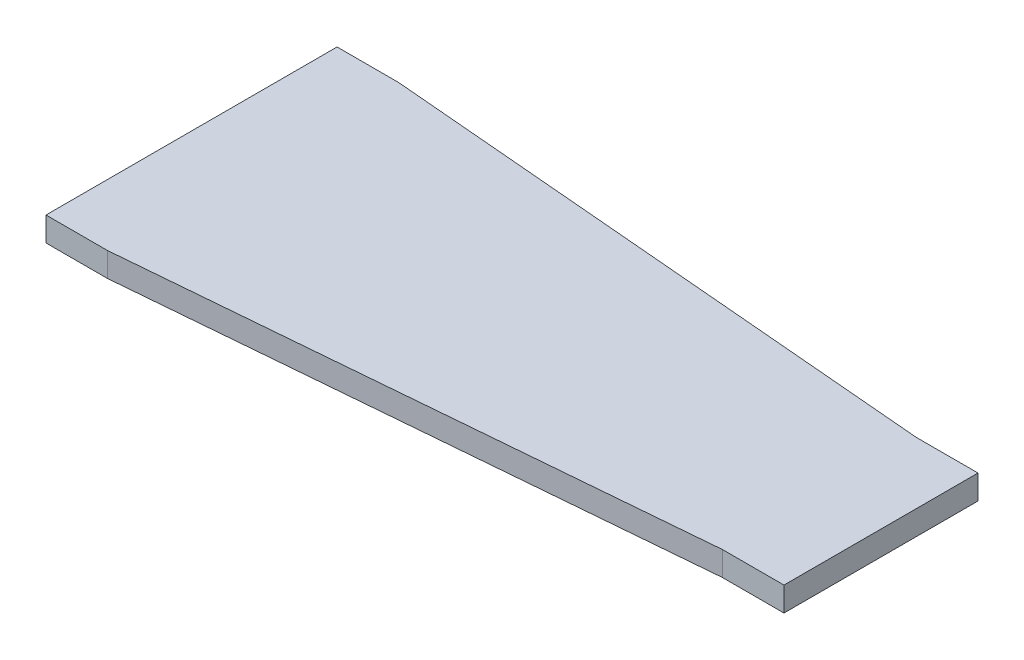
ISO-10303-21;
HEADER;
FILE_DESCRIPTION(('STEP AP214'),'2;1');
FILE_NAME('part.step','',(''),(''),'','','');
FILE_SCHEMA(('AUTOMOTIVE_DESIGN { 1 0 10303 214 1 1 1 1 }'));
ENDSEC;
DATA;
#1=APPLICATION_CONTEXT('core data for automotive mechanical design processes');
#2=APPLICATION_PROTOCOL_DEFINITION('international standard','automotive_design',2000,#1);
#3=PRODUCT_CONTEXT('',#1,'mechanical');
#4=PRODUCT('Part','Part','',(#3));
#5=PRODUCT_RELATED_PRODUCT_CATEGORY('part','',(#4));
#6=PRODUCT_DEFINITION_FORMATION('','',#4);
#7=PRODUCT_DEFINITION_CONTEXT('part definition',#1,'design');
#8=PRODUCT_DEFINITION('design','',#6,#7);
#9=PRODUCT_DEFINITION_SHAPE('','',#8);
#10=(LENGTH_UNIT() NAMED_UNIT(*) SI_UNIT(.MILLI.,.METRE.));
#11=(NAMED_UNIT(*) PLANE_ANGLE_UNIT() SI_UNIT($,.RADIAN.));
#12=(NAMED_UNIT(*) SI_UNIT($,.STERADIAN.) SOLID_ANGLE_UNIT());
#13=UNCERTAINTY_MEASURE_WITH_UNIT(LENGTH_MEASURE(1.E-05),#10,'distance_accuracy_value','');
#14=(GEOMETRIC_REPRESENTATION_CONTEXT(3) GLOBAL_UNCERTAINTY_ASSIGNED_CONTEXT((#13)) GLOBAL_UNIT_ASSIGNED_CONTEXT((#10,
#11,#12)) REPRESENTATION_CONTEXT('',''));
#15=CARTESIAN_POINT('',(0.,0.,0.));
#16=DIRECTION('',(0.,0.,1.));
#17=DIRECTION('',(1.,0.,0.));
#18=AXIS2_PLACEMENT_3D('',#15,#16,#17);
#19=CARTESIAN_POINT('',(258.85,10.,-40.0000000000002));
#20=DIRECTION('',(-1.,0.,0.));
#21=DIRECTION('',(0.,0.,1.));
#22=AXIS2_PLACEMENT_3D('',#19,#20,#21);
#23=PLANE('',#22);
#24=DIRECTION('',(0.,0.,-1.));
#25=VECTOR('',#24,1.);
#26=CARTESIAN_POINT('',(258.85,0.,-40.0000000000002));
#27=LINE('',#26,#25);
#28=CARTESIAN_POINT('',(258.85,0.,40.));
#29=VERTEX_POINT('',#28);
#30=CARTESIAN_POINT('',(258.85,0.,-40.0000000000002));
#31=VERTEX_POINT('',#30);
#32=EDGE_CURVE('E134',#29,#31,#27,.T.);
#33=ORIENTED_EDGE('',*,*,#32,.T.);
#34=DIRECTION('',(0.,-1.,0.));
#35=VECTOR('',#34,1.);
#36=CARTESIAN_POINT('',(258.85,10.,-40.0000000000002));
#37=LINE('',#36,#35);
#38=CARTESIAN_POINT('',(258.85,10.,-40.0000000000002));
#39=VERTEX_POINT('',#38);
#40=EDGE_CURVE('E11',#39,#31,#37,.T.);
#41=ORIENTED_EDGE('',*,*,#40,.F.);
#42=DIRECTION('',(0.,0.,-1.));
#43=VECTOR('',#42,1.);
#44=CARTESIAN_POINT('',(258.85,10.,-40.0000000000002));
#45=LINE('',#44,#43);
#46=CARTESIAN_POINT('',(258.85,10.,40.));
#47=VERTEX_POINT('',#46);
#48=EDGE_CURVE('E158',#47,#39,#45,.T.);
#49=ORIENTED_EDGE('',*,*,#48,.F.);
#50=DIRECTION('',(0.,-1.,0.));
#51=VECTOR('',#50,1.);
#52=CARTESIAN_POINT('',(258.85,10.,40.));
#53=LINE('',#52,#51);
#54=EDGE_CURVE('E125',#47,#29,#53,.T.);
#55=ORIENTED_EDGE('',*,*,#54,.T.);
#56=EDGE_LOOP('',(#33,#41,#49,#55));
#57=FACE_BOUND('',#56,.T.);
#58=ADVANCED_FACE('F33',(#57),#23,.F.);
#59=CARTESIAN_POINT('',(233.45,10.,-40.));
#60=DIRECTION('',(0.,0.,1.));
#61=DIRECTION('',(1.,0.,0.));
#62=AXIS2_PLACEMENT_3D('',#59,#60,#61);
#63=PLANE('',#62);
#64=DIRECTION('',(-1.,0.,0.));
#65=VECTOR('',#64,1.);
#66=CARTESIAN_POINT('',(233.45,0.,-40.));
#67=LINE('',#66,#65);
#68=CARTESIAN_POINT('',(233.45,0.,-40.));
#69=VERTEX_POINT('',#68);
#70=EDGE_CURVE('E137',#31,#69,#67,.T.);
#71=ORIENTED_EDGE('',*,*,#70,.T.);
#72=DIRECTION('',(0.,-1.,0.));
#73=VECTOR('',#72,1.);
#74=CARTESIAN_POINT('',(233.45,10.,-40.));
#75=LINE('',#74,#73);
#76=CARTESIAN_POINT('',(233.45,10.,-40.));
#77=VERTEX_POINT('',#76);
#78=EDGE_CURVE('E41',#77,#69,#75,.T.);
#79=ORIENTED_EDGE('',*,*,#78,.F.);
#80=DIRECTION('',(-1.,0.,0.));
#81=VECTOR('',#80,1.);
#82=CARTESIAN_POINT('',(233.45,10.,-40.));
#83=LINE('',#82,#81);
#84=EDGE_CURVE('E92',#39,#77,#83,.T.);
#85=ORIENTED_EDGE('',*,*,#84,.F.);
#86=ORIENTED_EDGE('',*,*,#40,.T.);
#87=EDGE_LOOP('',(#71,#79,#85,#86));
#88=FACE_BOUND('',#87,.T.);
#89=ADVANCED_FACE('F198',(#88),#63,.F.);
#90=CARTESIAN_POINT('',(233.45,10.,-40.));
#91=DIRECTION('',(-0.0853587731585585,0.,0.996350279693274));
#92=DIRECTION('',(0.996350279693274,0.,0.0853587731585585));
#93=AXIS2_PLACEMENT_3D('',#90,#91,#92);
#94=PLANE('',#93);
#95=CARTESIAN_POINT('',(233.45,0.,-40.));
#96=CARTESIAN_POINT('',(0.,0.,-60.));
#97=B_SPLINE_CURVE_WITH_KNOTS('',1,(#95,#96),.UNSPECIFIED.,.F.,.F.,(2,2),(0.,1.),.UNSPECIFIED.);
#98=CARTESIAN_POINT('',(0.,0.,-60.));
#99=VERTEX_POINT('',#98);
#100=EDGE_CURVE('E139',#69,#99,#97,.T.);
#101=ORIENTED_EDGE('',*,*,#100,.T.);
#102=DIRECTION('',(0.,-1.,0.));
#103=VECTOR('',#102,1.);
#104=CARTESIAN_POINT('',(0.,10.,-60.));
#105=LINE('',#104,#103);
#106=CARTESIAN_POINT('',(0.,10.,-60.));
#107=VERTEX_POINT('',#106);
#108=EDGE_CURVE('E165',#107,#99,#105,.T.);
#109=ORIENTED_EDGE('',*,*,#108,.F.);
#110=CARTESIAN_POINT('',(233.45,10.,-40.));
#111=CARTESIAN_POINT('',(0.,10.,-60.));
#112=B_SPLINE_CURVE_WITH_KNOTS('',1,(#110,#111),.UNSPECIFIED.,.F.,.F.,(2,2),(0.,1.),.UNSPECIFIED.);
#113=EDGE_CURVE('E173',#77,#107,#112,.T.);
#114=ORIENTED_EDGE('',*,*,#113,.F.);
#115=ORIENTED_EDGE('',*,*,#78,.T.);
#116=EDGE_LOOP('',(#101,#109,#114,#115));
#117=FACE_BOUND('',#116,.T.);
#118=ADVANCED_FACE('F171',(#117),#94,.F.);
#119=CARTESIAN_POINT('',(0.,10.,-60.));
#120=DIRECTION('',(0.,0.,1.));
#121=DIRECTION('',(1.,0.,0.));
#122=AXIS2_PLACEMENT_3D('',#119,#120,#121);
#123=PLANE('',#122);
#124=DIRECTION('',(-1.,0.,0.));
#125=VECTOR('',#124,1.);
#126=CARTESIAN_POINT('',(0.,0.,-60.));
#127=LINE('',#126,#125);
#128=CARTESIAN_POINT('',(-25.4,0.,-60.));
#129=VERTEX_POINT('',#128);
#130=EDGE_CURVE('E143',#99,#129,#127,.T.);
#131=ORIENTED_EDGE('',*,*,#130,.T.);
#132=DIRECTION('',(0.,-1.,0.));
#133=VECTOR('',#132,1.);
#134=CARTESIAN_POINT('',(-25.4,10.,-60.));
#135=LINE('',#134,#133);
#136=CARTESIAN_POINT('',(-25.4,10.,-60.));
#137=VERTEX_POINT('',#136);
#138=EDGE_CURVE('E162',#137,#129,#135,.T.);
#139=ORIENTED_EDGE('',*,*,#138,.F.);
#140=DIRECTION('',(-1.,0.,0.));
#141=VECTOR('',#140,1.);
#142=CARTESIAN_POINT('',(0.,10.,-60.));
#143=LINE('',#142,#141);
#144=EDGE_CURVE('E185',#107,#137,#143,.T.);
#145=ORIENTED_EDGE('',*,*,#144,.F.);
#146=ORIENTED_EDGE('',*,*,#108,.T.);
#147=EDGE_LOOP('',(#131,#139,#145,#146));
#148=FACE_BOUND('',#147,.T.);
#149=ADVANCED_FACE('F181',(#148),#123,.F.);
#150=CARTESIAN_POINT('',(-25.4,10.,-60.));
#151=DIRECTION('',(1.,0.,0.));
#152=DIRECTION('',(0.,0.,-1.));
#153=AXIS2_PLACEMENT_3D('',#150,#151,#152);
#154=PLANE('',#153);
#155=DIRECTION('',(0.,0.,1.));
#156=VECTOR('',#155,1.);
#157=CARTESIAN_POINT('',(-25.4,0.,-60.));
#158=LINE('',#157,#156);
#159=CARTESIAN_POINT('',(-25.4,0.,60.));
#160=VERTEX_POINT('',#159);
#161=EDGE_CURVE('E148',#129,#160,#158,.T.);
#162=ORIENTED_EDGE('',*,*,#161,.T.);
#163=DIRECTION('',(0.,-1.,0.));
#164=VECTOR('',#163,1.);
#165=CARTESIAN_POINT('',(-25.4,10.,60.));
#166=LINE('',#165,#164);
#167=CARTESIAN_POINT('',(-25.4,10.,60.));
#168=VERTEX_POINT('',#167);
#169=EDGE_CURVE('E120',#168,#160,#166,.T.);
#170=ORIENTED_EDGE('',*,*,#169,.F.);
#171=DIRECTION('',(0.,0.,1.));
#172=VECTOR('',#171,1.);
#173=CARTESIAN_POINT('',(-25.4,10.,-60.));
#174=LINE('',#173,#172);
#175=EDGE_CURVE('E111',#137,#168,#174,.T.);
#176=ORIENTED_EDGE('',*,*,#175,.F.);
#177=ORIENTED_EDGE('',*,*,#138,.T.);
#178=EDGE_LOOP('',(#162,#170,#176,#177));
#179=FACE_BOUND('',#178,.T.);
#180=ADVANCED_FACE('F184',(#179),#154,.F.);
#181=CARTESIAN_POINT('',(0.,10.,60.));
#182=DIRECTION('',(0.,0.,-1.));
#183=DIRECTION('',(-1.,0.,0.));
#184=AXIS2_PLACEMENT_3D('',#181,#182,#183);
#185=PLANE('',#184);
#186=DIRECTION('',(1.,0.,0.));
#187=VECTOR('',#186,1.);
#188=CARTESIAN_POINT('',(0.,0.,60.));
#189=LINE('',#188,#187);
#190=CARTESIAN_POINT('',(0.,0.,60.));
#191=VERTEX_POINT('',#190);
#192=EDGE_CURVE('E119',#160,#191,#189,.T.);
#193=ORIENTED_EDGE('',*,*,#192,.T.);
#194=DIRECTION('',(0.,-1.,0.));
#195=VECTOR('',#194,1.);
#196=CARTESIAN_POINT('',(0.,10.,60.));
#197=LINE('',#196,#195);
#198=CARTESIAN_POINT('',(0.,10.,60.));
#199=VERTEX_POINT('',#198);
#200=EDGE_CURVE('E116',#199,#191,#197,.T.);
#201=ORIENTED_EDGE('',*,*,#200,.F.);
#202=DIRECTION('',(1.,0.,0.));
#203=VECTOR('',#202,1.);
#204=CARTESIAN_POINT('',(0.,10.,60.));
#205=LINE('',#204,#203);
#206=EDGE_CURVE('E105',#168,#199,#205,.T.);
#207=ORIENTED_EDGE('',*,*,#206,.F.);
#208=ORIENTED_EDGE('',*,*,#169,.T.);
#209=EDGE_LOOP('',(#193,#201,#207,#208));
#210=FACE_BOUND('',#209,.T.);
#211=ADVANCED_FACE('F117',(#210),#185,.F.);
#212=CARTESIAN_POINT('',(0.,10.,60.));
#213=DIRECTION('',(-0.0853587731585585,0.,-0.996350279693274));
#214=DIRECTION('',(-0.996350279693274,0.,0.0853587731585585));
#215=AXIS2_PLACEMENT_3D('',#212,#213,#214);
#216=PLANE('',#215);
#217=CARTESIAN_POINT('',(0.,0.,60.));
#218=CARTESIAN_POINT('',(233.45,0.,40.));
#219=B_SPLINE_CURVE_WITH_KNOTS('',1,(#217,#218),.UNSPECIFIED.,.F.,.F.,(2,2),(0.,1.),.UNSPECIFIED.);
#220=CARTESIAN_POINT('',(233.45,0.,40.));
#221=VERTEX_POINT('',#220);
#222=EDGE_CURVE('E78',#191,#221,#219,.T.);
#223=ORIENTED_EDGE('',*,*,#222,.T.);
#224=DIRECTION('',(0.,-1.,0.));
#225=VECTOR('',#224,1.);
#226=CARTESIAN_POINT('',(233.45,10.,40.));
#227=LINE('',#226,#225);
#228=CARTESIAN_POINT('',(233.45,10.,40.));
#229=VERTEX_POINT('',#228);
#230=EDGE_CURVE('E121',#229,#221,#227,.T.);
#231=ORIENTED_EDGE('',*,*,#230,.F.);
#232=CARTESIAN_POINT('',(0.,10.,60.));
#233=CARTESIAN_POINT('',(233.45,10.,40.));
#234=B_SPLINE_CURVE_WITH_KNOTS('',1,(#232,#233),.UNSPECIFIED.,.F.,.F.,(2,2),(0.,1.),.UNSPECIFIED.);
#235=EDGE_CURVE('E109',#199,#229,#234,.T.);
#236=ORIENTED_EDGE('',*,*,#235,.F.);
#237=ORIENTED_EDGE('',*,*,#200,.T.);
#238=EDGE_LOOP('',(#223,#231,#236,#237));
#239=FACE_BOUND('',#238,.T.);
#240=ADVANCED_FACE('F123',(#239),#216,.F.);
#241=CARTESIAN_POINT('',(233.45,10.,40.));
#242=DIRECTION('',(0.,0.,-1.));
#243=DIRECTION('',(-1.,0.,0.));
#244=AXIS2_PLACEMENT_3D('',#241,#242,#243);
#245=PLANE('',#244);
#246=DIRECTION('',(1.,0.,0.));
#247=VECTOR('',#246,1.);
#248=CARTESIAN_POINT('',(233.45,0.,40.));
#249=LINE('',#248,#247);
#250=EDGE_CURVE('E84',#221,#29,#249,.T.);
#251=ORIENTED_EDGE('',*,*,#250,.T.);
#252=ORIENTED_EDGE('',*,*,#54,.F.);
#253=DIRECTION('',(1.,0.,0.));
#254=VECTOR('',#253,1.);
#255=CARTESIAN_POINT('',(233.45,10.,40.));
#256=LINE('',#255,#254);
#257=EDGE_CURVE('E49',#229,#47,#256,.T.);
#258=ORIENTED_EDGE('',*,*,#257,.F.);
#259=ORIENTED_EDGE('',*,*,#230,.T.);
#260=EDGE_LOOP('',(#251,#252,#258,#259));
#261=FACE_BOUND('',#260,.T.);
#262=ADVANCED_FACE('F214',(#261),#245,.F.);
#263=CARTESIAN_POINT('',(258.85,10.,-40.0000000000002));
#264=DIRECTION('',(0.,-1.,0.));
#265=DIRECTION('',(0.,0.,-1.));
#266=AXIS2_PLACEMENT_3D('',#263,#264,#265);
#267=PLANE('',#266);
#268=ORIENTED_EDGE('',*,*,#48,.T.);
#269=ORIENTED_EDGE('',*,*,#84,.T.);
#270=ORIENTED_EDGE('',*,*,#113,.T.);
#271=ORIENTED_EDGE('',*,*,#144,.T.);
#272=ORIENTED_EDGE('',*,*,#175,.T.);
#273=ORIENTED_EDGE('',*,*,#206,.T.);
#274=ORIENTED_EDGE('',*,*,#235,.T.);
#275=ORIENTED_EDGE('',*,*,#257,.T.);
#276=EDGE_LOOP('',(#268,#269,#270,#271,#272,#273,#274,#275));
#277=FACE_BOUND('',#276,.T.);
#278=ADVANCED_FACE('F107',(#277),#267,.F.);
#279=CARTESIAN_POINT('',(258.85,0.,-40.0000000000002));
#280=DIRECTION('',(0.,-1.,0.));
#281=DIRECTION('',(0.,0.,-1.));
#282=AXIS2_PLACEMENT_3D('',#279,#280,#281);
#283=PLANE('',#282);
#284=ORIENTED_EDGE('',*,*,#32,.F.);
#285=ORIENTED_EDGE('',*,*,#250,.F.);
#286=ORIENTED_EDGE('',*,*,#222,.F.);
#287=ORIENTED_EDGE('',*,*,#192,.F.);
#288=ORIENTED_EDGE('',*,*,#161,.F.);
#289=ORIENTED_EDGE('',*,*,#130,.F.);
#290=ORIENTED_EDGE('',*,*,#100,.F.);
#291=ORIENTED_EDGE('',*,*,#70,.F.);
#292=EDGE_LOOP('',(#284,#285,#286,#287,#288,#289,#290,#291));
#293=FACE_BOUND('',#292,.T.);
#294=ADVANCED_FACE('F177',(#293),#283,.T.);
#295=CLOSED_SHELL('',(#58,#89,#118,#149,#180,#211,#240,#262,#278,#294));
#296=MANIFOLD_SOLID_BREP('B2',#295);
#297=ADVANCED_BREP_SHAPE_REPRESENTATION('',(#18,#296),#14);
#298=SHAPE_DEFINITION_REPRESENTATION(#9,#297);
ENDSEC;
END-ISO-10303-21;
